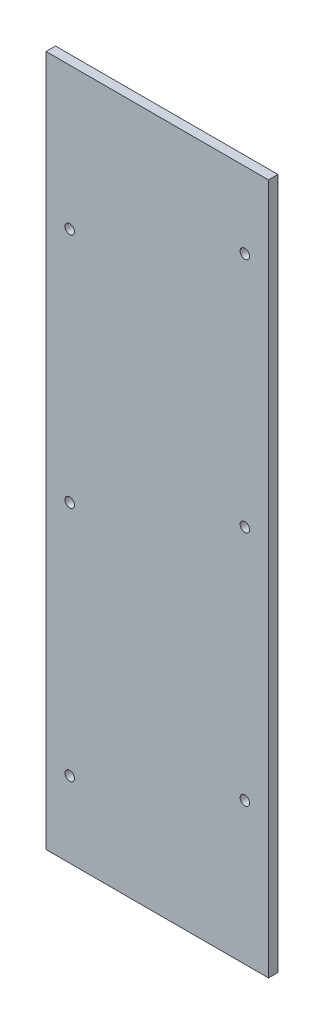
ISO-10303-21;
HEADER;
FILE_DESCRIPTION(('STEP AP214'),'2;1');
FILE_NAME('part.step','',(''),(''),'','','');
FILE_SCHEMA(('AUTOMOTIVE_DESIGN { 1 0 10303 214 1 1 1 1 }'));
ENDSEC;
DATA;
#1=APPLICATION_CONTEXT('core data for automotive mechanical design processes');
#2=APPLICATION_PROTOCOL_DEFINITION('international standard','automotive_design',2000,#1);
#3=PRODUCT_CONTEXT('',#1,'mechanical');
#4=PRODUCT('Part','Part','',(#3));
#5=PRODUCT_RELATED_PRODUCT_CATEGORY('part','',(#4));
#6=PRODUCT_DEFINITION_FORMATION('','',#4);
#7=PRODUCT_DEFINITION_CONTEXT('part definition',#1,'design');
#8=PRODUCT_DEFINITION('design','',#6,#7);
#9=PRODUCT_DEFINITION_SHAPE('','',#8);
#10=(LENGTH_UNIT() NAMED_UNIT(*) SI_UNIT(.MILLI.,.METRE.));
#11=(NAMED_UNIT(*) PLANE_ANGLE_UNIT() SI_UNIT($,.RADIAN.));
#12=(NAMED_UNIT(*) SI_UNIT($,.STERADIAN.) SOLID_ANGLE_UNIT());
#13=UNCERTAINTY_MEASURE_WITH_UNIT(LENGTH_MEASURE(1.E-05),#10,'distance_accuracy_value','');
#14=(GEOMETRIC_REPRESENTATION_CONTEXT(3) GLOBAL_UNCERTAINTY_ASSIGNED_CONTEXT((#13)) GLOBAL_UNIT_ASSIGNED_CONTEXT((#10,
#11,#12)) REPRESENTATION_CONTEXT('',''));
#15=CARTESIAN_POINT('',(0.,0.,0.));
#16=DIRECTION('',(0.,0.,1.));
#17=DIRECTION('',(1.,0.,0.));
#18=AXIS2_PLACEMENT_3D('',#15,#16,#17);
#19=CARTESIAN_POINT('',(47.,-146.,4.));
#20=DIRECTION('',(-1.,0.,0.));
#21=DIRECTION('',(0.,0.,1.));
#22=AXIS2_PLACEMENT_3D('',#19,#20,#21);
#23=PLANE('',#22);
#24=DIRECTION('',(0.,1.,0.));
#25=VECTOR('',#24,1.);
#26=CARTESIAN_POINT('',(47.,-146.,0.));
#27=LINE('',#26,#25);
#28=CARTESIAN_POINT('',(47.,-146.,0.));
#29=VERTEX_POINT('',#28);
#30=CARTESIAN_POINT('',(47.,146.,0.));
#31=VERTEX_POINT('',#30);
#32=EDGE_CURVE('E109',#29,#31,#27,.T.);
#33=ORIENTED_EDGE('',*,*,#32,.T.);
#34=DIRECTION('',(0.,0.,-1.));
#35=VECTOR('',#34,1.);
#36=CARTESIAN_POINT('',(47.,146.,4.));
#37=LINE('',#36,#35);
#38=CARTESIAN_POINT('',(47.,146.,4.));
#39=VERTEX_POINT('',#38);
#40=EDGE_CURVE('E11',#39,#31,#37,.T.);
#41=ORIENTED_EDGE('',*,*,#40,.F.);
#42=DIRECTION('',(0.,1.,0.));
#43=VECTOR('',#42,1.);
#44=CARTESIAN_POINT('',(47.,-146.,4.));
#45=LINE('',#44,#43);
#46=CARTESIAN_POINT('',(47.,-146.,4.));
#47=VERTEX_POINT('',#46);
#48=EDGE_CURVE('E93',#47,#39,#45,.T.);
#49=ORIENTED_EDGE('',*,*,#48,.F.);
#50=DIRECTION('',(0.,0.,-1.));
#51=VECTOR('',#50,1.);
#52=CARTESIAN_POINT('',(47.,-146.,4.));
#53=LINE('',#52,#51);
#54=EDGE_CURVE('E105',#47,#29,#53,.T.);
#55=ORIENTED_EDGE('',*,*,#54,.T.);
#56=EDGE_LOOP('',(#33,#41,#49,#55));
#57=FACE_BOUND('',#56,.T.);
#58=ADVANCED_FACE('F41',(#57),#23,.F.);
#59=CARTESIAN_POINT('',(-47.,146.,4.));
#60=DIRECTION('',(0.,-1.,0.));
#61=DIRECTION('',(0.,0.,-1.));
#62=AXIS2_PLACEMENT_3D('',#59,#60,#61);
#63=PLANE('',#62);
#64=DIRECTION('',(-1.,0.,0.));
#65=VECTOR('',#64,1.);
#66=CARTESIAN_POINT('',(-47.,146.,0.));
#67=LINE('',#66,#65);
#68=CARTESIAN_POINT('',(-47.,146.,0.));
#69=VERTEX_POINT('',#68);
#70=EDGE_CURVE('E98',#31,#69,#67,.T.);
#71=ORIENTED_EDGE('',*,*,#70,.T.);
#72=DIRECTION('',(0.,0.,-1.));
#73=VECTOR('',#72,1.);
#74=CARTESIAN_POINT('',(-47.,146.,4.));
#75=LINE('',#74,#73);
#76=CARTESIAN_POINT('',(-47.,146.,4.));
#77=VERTEX_POINT('',#76);
#78=EDGE_CURVE('E50',#77,#69,#75,.T.);
#79=ORIENTED_EDGE('',*,*,#78,.F.);
#80=DIRECTION('',(-1.,0.,0.));
#81=VECTOR('',#80,1.);
#82=CARTESIAN_POINT('',(-47.,146.,4.));
#83=LINE('',#82,#81);
#84=EDGE_CURVE('E88',#39,#77,#83,.T.);
#85=ORIENTED_EDGE('',*,*,#84,.F.);
#86=ORIENTED_EDGE('',*,*,#40,.T.);
#87=EDGE_LOOP('',(#71,#79,#85,#86));
#88=FACE_BOUND('',#87,.T.);
#89=ADVANCED_FACE('F97',(#88),#63,.F.);
#90=CARTESIAN_POINT('',(-47.,-146.,4.));
#91=DIRECTION('',(1.,0.,0.));
#92=DIRECTION('',(0.,0.,-1.));
#93=AXIS2_PLACEMENT_3D('',#90,#91,#92);
#94=PLANE('',#93);
#95=DIRECTION('',(0.,-1.,0.));
#96=VECTOR('',#95,1.);
#97=CARTESIAN_POINT('',(-47.,-146.,0.));
#98=LINE('',#97,#96);
#99=CARTESIAN_POINT('',(-47.,-146.,0.));
#100=VERTEX_POINT('',#99);
#101=EDGE_CURVE('E75',#69,#100,#98,.T.);
#102=ORIENTED_EDGE('',*,*,#101,.T.);
#103=DIRECTION('',(0.,0.,-1.));
#104=VECTOR('',#103,1.);
#105=CARTESIAN_POINT('',(-47.,-146.,4.));
#106=LINE('',#105,#104);
#107=CARTESIAN_POINT('',(-47.,-146.,4.));
#108=VERTEX_POINT('',#107);
#109=EDGE_CURVE('E100',#108,#100,#106,.T.);
#110=ORIENTED_EDGE('',*,*,#109,.F.);
#111=DIRECTION('',(0.,-1.,0.));
#112=VECTOR('',#111,1.);
#113=CARTESIAN_POINT('',(-47.,-146.,4.));
#114=LINE('',#113,#112);
#115=EDGE_CURVE('E91',#77,#108,#114,.T.);
#116=ORIENTED_EDGE('',*,*,#115,.F.);
#117=ORIENTED_EDGE('',*,*,#78,.T.);
#118=EDGE_LOOP('',(#102,#110,#116,#117));
#119=FACE_BOUND('',#118,.T.);
#120=ADVANCED_FACE('F101',(#119),#94,.F.);
#121=CARTESIAN_POINT('',(-47.,-146.,4.));
#122=DIRECTION('',(0.,1.,0.));
#123=DIRECTION('',(0.,0.,1.));
#124=AXIS2_PLACEMENT_3D('',#121,#122,#123);
#125=PLANE('',#124);
#126=DIRECTION('',(1.,0.,0.));
#127=VECTOR('',#126,1.);
#128=CARTESIAN_POINT('',(-47.,-146.,0.));
#129=LINE('',#128,#127);
#130=EDGE_CURVE('E81',#100,#29,#129,.T.);
#131=ORIENTED_EDGE('',*,*,#130,.T.);
#132=ORIENTED_EDGE('',*,*,#54,.F.);
#133=DIRECTION('',(1.,0.,0.));
#134=VECTOR('',#133,1.);
#135=CARTESIAN_POINT('',(-47.,-146.,4.));
#136=LINE('',#135,#134);
#137=EDGE_CURVE('E58',#108,#47,#136,.T.);
#138=ORIENTED_EDGE('',*,*,#137,.F.);
#139=ORIENTED_EDGE('',*,*,#109,.T.);
#140=EDGE_LOOP('',(#131,#132,#138,#139));
#141=FACE_BOUND('',#140,.T.);
#142=ADVANCED_FACE('F123',(#141),#125,.F.);
#143=CARTESIAN_POINT('',(0.,0.,4.));
#144=DIRECTION('',(0.,0.,-1.));
#145=DIRECTION('',(-1.,0.,0.));
#146=AXIS2_PLACEMENT_3D('',#143,#144,#145);
#147=PLANE('',#146);
#148=CARTESIAN_POINT('',(-37.,-114.,4.));
#149=DIRECTION('',(0.,0.,1.));
#150=DIRECTION('',(1.,0.,0.));
#151=AXIS2_PLACEMENT_3D('',#148,#149,#150);
#152=CIRCLE('',#151,2.);
#153=CARTESIAN_POINT('',(-35.,-114.,4.));
#154=VERTEX_POINT('',#153);
#155=EDGE_CURVE('E170',#154,#154,#152,.T.);
#156=ORIENTED_EDGE('',*,*,#155,.F.);
#157=EDGE_LOOP('',(#156));
#158=FACE_BOUND('',#157,.T.);
#159=CARTESIAN_POINT('',(37.,-86.,4.));
#160=DIRECTION('',(0.,0.,1.));
#161=DIRECTION('',(1.,0.,0.));
#162=AXIS2_PLACEMENT_3D('',#159,#160,#161);
#163=CIRCLE('',#162,2.);
#164=CARTESIAN_POINT('',(39.,-86.,4.));
#165=VERTEX_POINT('',#164);
#166=EDGE_CURVE('E166',#165,#165,#163,.T.);
#167=ORIENTED_EDGE('',*,*,#166,.F.);
#168=EDGE_LOOP('',(#167));
#169=FACE_BOUND('',#168,.T.);
#170=CARTESIAN_POINT('',(37.,14.,4.));
#171=DIRECTION('',(0.,0.,1.));
#172=DIRECTION('',(1.,0.,0.));
#173=AXIS2_PLACEMENT_3D('',#170,#171,#172);
#174=CIRCLE('',#173,2.);
#175=CARTESIAN_POINT('',(39.,14.,4.));
#176=VERTEX_POINT('',#175);
#177=EDGE_CURVE('E158',#176,#176,#174,.T.);
#178=ORIENTED_EDGE('',*,*,#177,.F.);
#179=EDGE_LOOP('',(#178));
#180=FACE_BOUND('',#179,.T.);
#181=CARTESIAN_POINT('',(-37.,-14.,4.));
#182=DIRECTION('',(0.,0.,1.));
#183=DIRECTION('',(1.,0.,0.));
#184=AXIS2_PLACEMENT_3D('',#181,#182,#183);
#185=CIRCLE('',#184,2.);
#186=CARTESIAN_POINT('',(-35.,-14.,4.));
#187=VERTEX_POINT('',#186);
#188=EDGE_CURVE('E150',#187,#187,#185,.T.);
#189=ORIENTED_EDGE('',*,*,#188,.F.);
#190=EDGE_LOOP('',(#189));
#191=FACE_BOUND('',#190,.T.);
#192=CARTESIAN_POINT('',(-37.,86.,4.));
#193=DIRECTION('',(0.,0.,1.));
#194=DIRECTION('',(1.,0.,0.));
#195=AXIS2_PLACEMENT_3D('',#192,#193,#194);
#196=CIRCLE('',#195,2.);
#197=CARTESIAN_POINT('',(-35.,86.,4.));
#198=VERTEX_POINT('',#197);
#199=EDGE_CURVE('E142',#198,#198,#196,.T.);
#200=ORIENTED_EDGE('',*,*,#199,.F.);
#201=EDGE_LOOP('',(#200));
#202=FACE_BOUND('',#201,.T.);
#203=CARTESIAN_POINT('',(37.,114.,4.));
#204=DIRECTION('',(0.,0.,1.));
#205=DIRECTION('',(1.,0.,0.));
#206=AXIS2_PLACEMENT_3D('',#203,#204,#205);
#207=CIRCLE('',#206,2.);
#208=CARTESIAN_POINT('',(39.,114.,4.));
#209=VERTEX_POINT('',#208);
#210=EDGE_CURVE('E134',#209,#209,#207,.T.);
#211=ORIENTED_EDGE('',*,*,#210,.F.);
#212=EDGE_LOOP('',(#211));
#213=FACE_BOUND('',#212,.T.);
#214=ORIENTED_EDGE('',*,*,#48,.T.);
#215=ORIENTED_EDGE('',*,*,#84,.T.);
#216=ORIENTED_EDGE('',*,*,#115,.T.);
#217=ORIENTED_EDGE('',*,*,#137,.T.);
#218=EDGE_LOOP('',(#214,#215,#216,#217));
#219=FACE_BOUND('',#218,.T.);
#220=ADVANCED_FACE('F89',(#158,#169,#180,#191,#202,#213,#219),#147,.F.);
#221=CARTESIAN_POINT('',(0.,0.,0.));
#222=DIRECTION('',(0.,0.,-1.));
#223=DIRECTION('',(-1.,0.,0.));
#224=AXIS2_PLACEMENT_3D('',#221,#222,#223);
#225=PLANE('',#224);
#226=CARTESIAN_POINT('',(-37.,-114.,0.));
#227=DIRECTION('',(0.,0.,1.));
#228=DIRECTION('',(1.,0.,0.));
#229=AXIS2_PLACEMENT_3D('',#226,#227,#228);
#230=CIRCLE('',#229,2.);
#231=CARTESIAN_POINT('',(-35.,-114.,0.));
#232=VERTEX_POINT('',#231);
#233=EDGE_CURVE('E113',#232,#232,#230,.T.);
#234=ORIENTED_EDGE('',*,*,#233,.T.);
#235=EDGE_LOOP('',(#234));
#236=FACE_BOUND('',#235,.T.);
#237=CARTESIAN_POINT('',(37.,-86.,0.));
#238=DIRECTION('',(0.,0.,1.));
#239=DIRECTION('',(1.,0.,0.));
#240=AXIS2_PLACEMENT_3D('',#237,#238,#239);
#241=CIRCLE('',#240,2.);
#242=CARTESIAN_POINT('',(39.,-86.,0.));
#243=VERTEX_POINT('',#242);
#244=EDGE_CURVE('E162',#243,#243,#241,.T.);
#245=ORIENTED_EDGE('',*,*,#244,.T.);
#246=EDGE_LOOP('',(#245));
#247=FACE_BOUND('',#246,.T.);
#248=CARTESIAN_POINT('',(37.,14.,0.));
#249=DIRECTION('',(0.,0.,1.));
#250=DIRECTION('',(1.,0.,0.));
#251=AXIS2_PLACEMENT_3D('',#248,#249,#250);
#252=CIRCLE('',#251,2.);
#253=CARTESIAN_POINT('',(39.,14.,0.));
#254=VERTEX_POINT('',#253);
#255=EDGE_CURVE('E154',#254,#254,#252,.T.);
#256=ORIENTED_EDGE('',*,*,#255,.T.);
#257=EDGE_LOOP('',(#256));
#258=FACE_BOUND('',#257,.T.);
#259=CARTESIAN_POINT('',(-37.,-14.,0.));
#260=DIRECTION('',(0.,0.,1.));
#261=DIRECTION('',(1.,0.,0.));
#262=AXIS2_PLACEMENT_3D('',#259,#260,#261);
#263=CIRCLE('',#262,2.);
#264=CARTESIAN_POINT('',(-35.,-14.,0.));
#265=VERTEX_POINT('',#264);
#266=EDGE_CURVE('E146',#265,#265,#263,.T.);
#267=ORIENTED_EDGE('',*,*,#266,.T.);
#268=EDGE_LOOP('',(#267));
#269=FACE_BOUND('',#268,.T.);
#270=CARTESIAN_POINT('',(-37.,86.,0.));
#271=DIRECTION('',(0.,0.,1.));
#272=DIRECTION('',(1.,0.,0.));
#273=AXIS2_PLACEMENT_3D('',#270,#271,#272);
#274=CIRCLE('',#273,2.);
#275=CARTESIAN_POINT('',(-35.,86.,0.));
#276=VERTEX_POINT('',#275);
#277=EDGE_CURVE('E138',#276,#276,#274,.T.);
#278=ORIENTED_EDGE('',*,*,#277,.T.);
#279=EDGE_LOOP('',(#278));
#280=FACE_BOUND('',#279,.T.);
#281=CARTESIAN_POINT('',(37.,114.,0.));
#282=DIRECTION('',(0.,0.,1.));
#283=DIRECTION('',(1.,0.,0.));
#284=AXIS2_PLACEMENT_3D('',#281,#282,#283);
#285=CIRCLE('',#284,2.);
#286=CARTESIAN_POINT('',(39.,114.,0.));
#287=VERTEX_POINT('',#286);
#288=EDGE_CURVE('E130',#287,#287,#285,.T.);
#289=ORIENTED_EDGE('',*,*,#288,.T.);
#290=EDGE_LOOP('',(#289));
#291=FACE_BOUND('',#290,.T.);
#292=ORIENTED_EDGE('',*,*,#32,.F.);
#293=ORIENTED_EDGE('',*,*,#130,.F.);
#294=ORIENTED_EDGE('',*,*,#101,.F.);
#295=ORIENTED_EDGE('',*,*,#70,.F.);
#296=EDGE_LOOP('',(#292,#293,#294,#295));
#297=FACE_BOUND('',#296,.T.);
#298=ADVANCED_FACE('F126',(#236,#247,#258,#269,#280,#291,#297),#225,.T.);
#299=CARTESIAN_POINT('',(37.,114.,0.));
#300=DIRECTION('',(0.,0.,1.));
#301=DIRECTION('',(1.,0.,0.));
#302=AXIS2_PLACEMENT_3D('',#299,#300,#301);
#303=CYLINDRICAL_SURFACE('',#302,2.);
#304=ORIENTED_EDGE('',*,*,#288,.F.);
#305=EDGE_LOOP('',(#304));
#306=FACE_BOUND('',#305,.T.);
#307=ORIENTED_EDGE('',*,*,#210,.T.);
#308=EDGE_LOOP('',(#307));
#309=FACE_BOUND('',#308,.T.);
#310=ADVANCED_FACE('F200',(#306,#309),#303,.F.);
#311=CARTESIAN_POINT('',(-37.,86.,0.));
#312=DIRECTION('',(0.,0.,1.));
#313=DIRECTION('',(1.,0.,0.));
#314=AXIS2_PLACEMENT_3D('',#311,#312,#313);
#315=CYLINDRICAL_SURFACE('',#314,2.);
#316=ORIENTED_EDGE('',*,*,#277,.F.);
#317=EDGE_LOOP('',(#316));
#318=FACE_BOUND('',#317,.T.);
#319=ORIENTED_EDGE('',*,*,#199,.T.);
#320=EDGE_LOOP('',(#319));
#321=FACE_BOUND('',#320,.T.);
#322=ADVANCED_FACE('F202',(#318,#321),#315,.F.);
#323=CARTESIAN_POINT('',(-37.,-14.,0.));
#324=DIRECTION('',(0.,0.,1.));
#325=DIRECTION('',(1.,0.,0.));
#326=AXIS2_PLACEMENT_3D('',#323,#324,#325);
#327=CYLINDRICAL_SURFACE('',#326,2.);
#328=ORIENTED_EDGE('',*,*,#266,.F.);
#329=EDGE_LOOP('',(#328));
#330=FACE_BOUND('',#329,.T.);
#331=ORIENTED_EDGE('',*,*,#188,.T.);
#332=EDGE_LOOP('',(#331));
#333=FACE_BOUND('',#332,.T.);
#334=ADVANCED_FACE('F209',(#330,#333),#327,.F.);
#335=CARTESIAN_POINT('',(37.,14.,0.));
#336=DIRECTION('',(0.,0.,1.));
#337=DIRECTION('',(1.,0.,0.));
#338=AXIS2_PLACEMENT_3D('',#335,#336,#337);
#339=CYLINDRICAL_SURFACE('',#338,2.);
#340=ORIENTED_EDGE('',*,*,#255,.F.);
#341=EDGE_LOOP('',(#340));
#342=FACE_BOUND('',#341,.T.);
#343=ORIENTED_EDGE('',*,*,#177,.T.);
#344=EDGE_LOOP('',(#343));
#345=FACE_BOUND('',#344,.T.);
#346=ADVANCED_FACE('F255',(#342,#345),#339,.F.);
#347=CARTESIAN_POINT('',(37.,-86.,0.));
#348=DIRECTION('',(0.,0.,1.));
#349=DIRECTION('',(1.,0.,0.));
#350=AXIS2_PLACEMENT_3D('',#347,#348,#349);
#351=CYLINDRICAL_SURFACE('',#350,2.);
#352=ORIENTED_EDGE('',*,*,#244,.F.);
#353=EDGE_LOOP('',(#352));
#354=FACE_BOUND('',#353,.T.);
#355=ORIENTED_EDGE('',*,*,#166,.T.);
#356=EDGE_LOOP('',(#355));
#357=FACE_BOUND('',#356,.T.);
#358=ADVANCED_FACE('F183',(#354,#357),#351,.F.);
#359=CARTESIAN_POINT('',(-37.,-114.,0.));
#360=DIRECTION('',(0.,0.,1.));
#361=DIRECTION('',(1.,0.,0.));
#362=AXIS2_PLACEMENT_3D('',#359,#360,#361);
#363=CYLINDRICAL_SURFACE('',#362,2.);
#364=ORIENTED_EDGE('',*,*,#233,.F.);
#365=EDGE_LOOP('',(#364));
#366=FACE_BOUND('',#365,.T.);
#367=ORIENTED_EDGE('',*,*,#155,.T.);
#368=EDGE_LOOP('',(#367));
#369=FACE_BOUND('',#368,.T.);
#370=ADVANCED_FACE('F180',(#366,#369),#363,.F.);
#371=CLOSED_SHELL('',(#58,#89,#120,#142,#220,#298,#310,#322,#334,#346,#358,#370));
#372=MANIFOLD_SOLID_BREP('B2',#371);
#373=ADVANCED_BREP_SHAPE_REPRESENTATION('',(#18,#372),#14);
#374=SHAPE_DEFINITION_REPRESENTATION(#9,#373);
ENDSEC;
END-ISO-10303-21;
